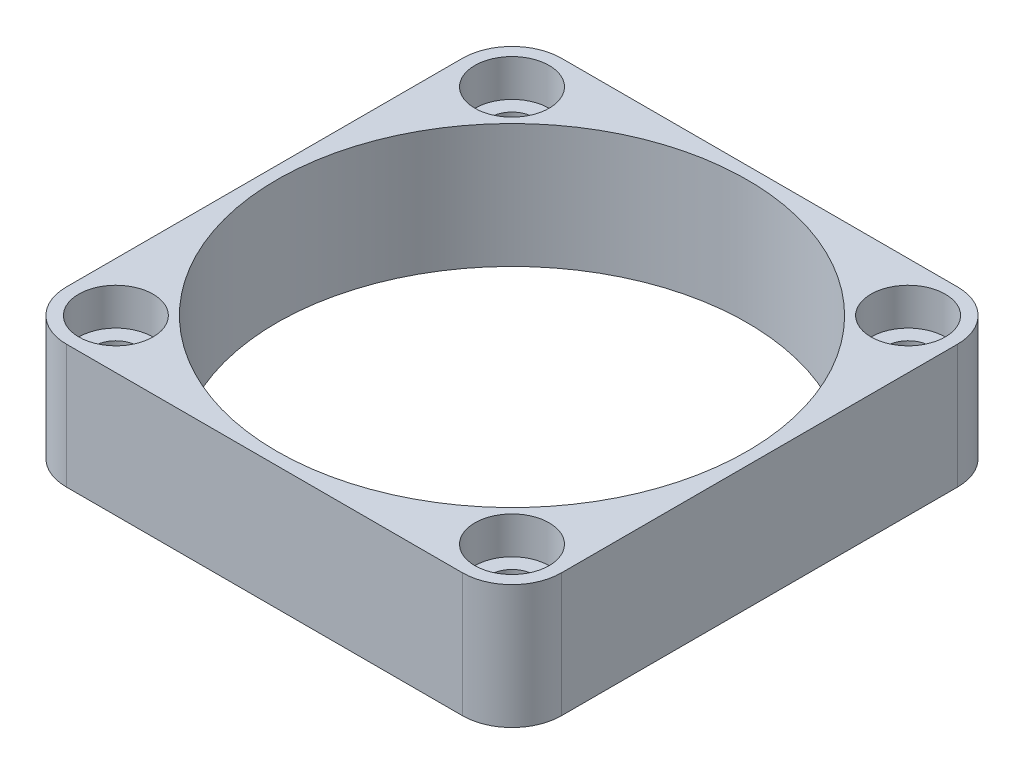
ISO-10303-21;
HEADER;
FILE_DESCRIPTION(('STEP AP214'),'2;1');
FILE_NAME('part.step','',(''),(''),'','','');
FILE_SCHEMA(('AUTOMOTIVE_DESIGN { 1 0 10303 214 1 1 1 1 }'));
ENDSEC;
DATA;
#1=APPLICATION_CONTEXT('core data for automotive mechanical design processes');
#2=APPLICATION_PROTOCOL_DEFINITION('international standard','automotive_design',2000,#1);
#3=PRODUCT_CONTEXT('',#1,'mechanical');
#4=PRODUCT('Part','Part','',(#3));
#5=PRODUCT_RELATED_PRODUCT_CATEGORY('part','',(#4));
#6=PRODUCT_DEFINITION_FORMATION('','',#4);
#7=PRODUCT_DEFINITION_CONTEXT('part definition',#1,'design');
#8=PRODUCT_DEFINITION('design','',#6,#7);
#9=PRODUCT_DEFINITION_SHAPE('','',#8);
#10=(LENGTH_UNIT() NAMED_UNIT(*) SI_UNIT(.MILLI.,.METRE.));
#11=(NAMED_UNIT(*) PLANE_ANGLE_UNIT() SI_UNIT($,.RADIAN.));
#12=(NAMED_UNIT(*) SI_UNIT($,.STERADIAN.) SOLID_ANGLE_UNIT());
#13=UNCERTAINTY_MEASURE_WITH_UNIT(LENGTH_MEASURE(1.E-05),#10,'distance_accuracy_value','');
#14=(GEOMETRIC_REPRESENTATION_CONTEXT(3) GLOBAL_UNCERTAINTY_ASSIGNED_CONTEXT((#13)) GLOBAL_UNIT_ASSIGNED_CONTEXT((#10,
#11,#12)) REPRESENTATION_CONTEXT('',''));
#15=CARTESIAN_POINT('',(0.,0.,0.));
#16=DIRECTION('',(0.,0.,1.));
#17=DIRECTION('',(1.,0.,0.));
#18=AXIS2_PLACEMENT_3D('',#15,#16,#17);
#19=CARTESIAN_POINT('',(4.,0.,-36.));
#20=DIRECTION('',(0.,1.,0.));
#21=DIRECTION('',(0.,0.,1.));
#22=AXIS2_PLACEMENT_3D('',#19,#20,#21);
#23=PLANE('',#22);
#24=CARTESIAN_POINT('',(20.,0.,-20.));
#25=DIRECTION('',(0.,1.,0.));
#26=DIRECTION('',(0.,0.,1.));
#27=AXIS2_PLACEMENT_3D('',#24,#25,#26);
#28=CIRCLE('',#27,19.);
#29=CARTESIAN_POINT('',(20.,0.,-1.));
#30=VERTEX_POINT('',#29);
#31=EDGE_CURVE('E298',#30,#30,#28,.T.);
#32=ORIENTED_EDGE('',*,*,#31,.T.);
#33=EDGE_LOOP('',(#32));
#34=FACE_BOUND('',#33,.T.);
#35=CARTESIAN_POINT('',(4.,0.,-4.));
#36=DIRECTION('',(0.,1.,0.));
#37=DIRECTION('',(0.,0.,1.));
#38=AXIS2_PLACEMENT_3D('',#35,#36,#37);
#39=CIRCLE('',#38,1.75);
#40=CARTESIAN_POINT('',(4.,0.,-2.25));
#41=VERTEX_POINT('',#40);
#42=EDGE_CURVE('E313',#41,#41,#39,.T.);
#43=ORIENTED_EDGE('',*,*,#42,.T.);
#44=EDGE_LOOP('',(#43));
#45=FACE_BOUND('',#44,.T.);
#46=CARTESIAN_POINT('',(36.,0.,-36.));
#47=DIRECTION('',(0.,1.,0.));
#48=DIRECTION('',(0.,0.,1.));
#49=AXIS2_PLACEMENT_3D('',#46,#47,#48);
#50=CIRCLE('',#49,1.75);
#51=CARTESIAN_POINT('',(36.,0.,-34.25));
#52=VERTEX_POINT('',#51);
#53=EDGE_CURVE('E178',#52,#52,#50,.T.);
#54=ORIENTED_EDGE('',*,*,#53,.T.);
#55=EDGE_LOOP('',(#54));
#56=FACE_BOUND('',#55,.T.);
#57=CARTESIAN_POINT('',(4.,0.,-36.));
#58=DIRECTION('',(0.,1.,0.));
#59=DIRECTION('',(0.,0.,1.));
#60=AXIS2_PLACEMENT_3D('',#57,#58,#59);
#61=CIRCLE('',#60,4.);
#62=CARTESIAN_POINT('',(4.00000000000003,0.,-40.));
#63=VERTEX_POINT('',#62);
#64=CARTESIAN_POINT('',(0.,0.,-36.));
#65=VERTEX_POINT('',#64);
#66=EDGE_CURVE('E149',#63,#65,#61,.T.);
#67=ORIENTED_EDGE('',*,*,#66,.F.);
#68=DIRECTION('',(-1.,0.,0.));
#69=VECTOR('',#68,1.);
#70=CARTESIAN_POINT('',(4.00000000000003,0.,-40.));
#71=LINE('',#70,#69);
#72=CARTESIAN_POINT('',(36.,0.,-40.));
#73=VERTEX_POINT('',#72);
#74=EDGE_CURVE('E103',#73,#63,#71,.T.);
#75=ORIENTED_EDGE('',*,*,#74,.F.);
#76=CARTESIAN_POINT('',(36.,0.,-36.));
#77=DIRECTION('',(0.,1.,0.));
#78=DIRECTION('',(0.,0.,1.));
#79=AXIS2_PLACEMENT_3D('',#76,#77,#78);
#80=CIRCLE('',#79,4.);
#81=CARTESIAN_POINT('',(40.,0.,-36.));
#82=VERTEX_POINT('',#81);
#83=EDGE_CURVE('E100',#82,#73,#80,.T.);
#84=ORIENTED_EDGE('',*,*,#83,.F.);
#85=DIRECTION('',(0.,0.,-1.));
#86=VECTOR('',#85,1.);
#87=CARTESIAN_POINT('',(40.,0.,-4.00000000000003));
#88=LINE('',#87,#86);
#89=CARTESIAN_POINT('',(40.,0.,-4.00000000000003));
#90=VERTEX_POINT('',#89);
#91=EDGE_CURVE('E139',#90,#82,#88,.T.);
#92=ORIENTED_EDGE('',*,*,#91,.F.);
#93=CARTESIAN_POINT('',(36.,0.,-4.));
#94=DIRECTION('',(0.,1.,0.));
#95=DIRECTION('',(0.,0.,-1.));
#96=AXIS2_PLACEMENT_3D('',#93,#94,#95);
#97=CIRCLE('',#96,4.);
#98=CARTESIAN_POINT('',(36.,0.,0.));
#99=VERTEX_POINT('',#98);
#100=EDGE_CURVE('E157',#99,#90,#97,.T.);
#101=ORIENTED_EDGE('',*,*,#100,.F.);
#102=DIRECTION('',(1.,0.,0.));
#103=VECTOR('',#102,1.);
#104=CARTESIAN_POINT('',(4.00000000000003,0.,0.));
#105=LINE('',#104,#103);
#106=CARTESIAN_POINT('',(4.00000000000003,0.,0.));
#107=VERTEX_POINT('',#106);
#108=EDGE_CURVE('E160',#107,#99,#105,.T.);
#109=ORIENTED_EDGE('',*,*,#108,.F.);
#110=CARTESIAN_POINT('',(4.,0.,-4.));
#111=DIRECTION('',(0.,1.,0.));
#112=DIRECTION('',(0.,0.,1.));
#113=AXIS2_PLACEMENT_3D('',#110,#111,#112);
#114=CIRCLE('',#113,4.);
#115=CARTESIAN_POINT('',(0.,0.,-4.00000000000003));
#116=VERTEX_POINT('',#115);
#117=EDGE_CURVE('E154',#116,#107,#114,.T.);
#118=ORIENTED_EDGE('',*,*,#117,.F.);
#119=DIRECTION('',(0.,0.,1.));
#120=VECTOR('',#119,1.);
#121=CARTESIAN_POINT('',(0.,0.,-4.00000000000003));
#122=LINE('',#121,#120);
#123=EDGE_CURVE('E155',#65,#116,#122,.T.);
#124=ORIENTED_EDGE('',*,*,#123,.F.);
#125=EDGE_LOOP('',(#67,#75,#84,#92,#101,#109,#118,#124));
#126=FACE_BOUND('',#125,.T.);
#127=CARTESIAN_POINT('',(4.,0.,-36.));
#128=DIRECTION('',(0.,1.,0.));
#129=DIRECTION('',(0.,0.,1.));
#130=AXIS2_PLACEMENT_3D('',#127,#128,#129);
#131=CIRCLE('',#130,1.75);
#132=CARTESIAN_POINT('',(4.,0.,-34.25));
#133=VERTEX_POINT('',#132);
#134=EDGE_CURVE('E306',#133,#133,#131,.F.);
#135=ORIENTED_EDGE('',*,*,#134,.F.);
#136=EDGE_LOOP('',(#135));
#137=FACE_BOUND('',#136,.T.);
#138=CARTESIAN_POINT('',(36.,0.,-4.));
#139=DIRECTION('',(0.,-1.,0.));
#140=DIRECTION('',(0.,0.,-1.));
#141=AXIS2_PLACEMENT_3D('',#138,#139,#140);
#142=CIRCLE('',#141,1.75);
#143=CARTESIAN_POINT('',(36.,0.,-5.75));
#144=VERTEX_POINT('',#143);
#145=EDGE_CURVE('E301',#144,#144,#142,.T.);
#146=ORIENTED_EDGE('',*,*,#145,.F.);
#147=EDGE_LOOP('',(#146));
#148=FACE_BOUND('',#147,.T.);
#149=ADVANCED_FACE('F47',(#34,#45,#56,#126,#137,#148),#23,.F.);
#150=CARTESIAN_POINT('',(4.,10.,-36.));
#151=DIRECTION('',(0.,1.,0.));
#152=DIRECTION('',(0.,0.,1.));
#153=AXIS2_PLACEMENT_3D('',#150,#151,#152);
#154=PLANE('',#153);
#155=CARTESIAN_POINT('',(20.,10.,-20.));
#156=DIRECTION('',(0.,1.,0.));
#157=DIRECTION('',(0.,0.,1.));
#158=AXIS2_PLACEMENT_3D('',#155,#156,#157);
#159=CIRCLE('',#158,19.);
#160=CARTESIAN_POINT('',(20.,10.,-1.));
#161=VERTEX_POINT('',#160);
#162=EDGE_CURVE('E303',#161,#161,#159,.T.);
#163=ORIENTED_EDGE('',*,*,#162,.F.);
#164=EDGE_LOOP('',(#163));
#165=FACE_BOUND('',#164,.T.);
#166=CARTESIAN_POINT('',(4.,10.,-36.));
#167=DIRECTION('',(0.,1.,0.));
#168=DIRECTION('',(0.,0.,1.));
#169=AXIS2_PLACEMENT_3D('',#166,#167,#168);
#170=CIRCLE('',#169,3.);
#171=CARTESIAN_POINT('',(4.,10.,-33.));
#172=VERTEX_POINT('',#171);
#173=EDGE_CURVE('E319',#172,#172,#170,.F.);
#174=ORIENTED_EDGE('',*,*,#173,.T.);
#175=EDGE_LOOP('',(#174));
#176=FACE_BOUND('',#175,.T.);
#177=CARTESIAN_POINT('',(36.,10.,-36.));
#178=DIRECTION('',(0.,1.,0.));
#179=DIRECTION('',(0.,0.,1.));
#180=AXIS2_PLACEMENT_3D('',#177,#178,#179);
#181=CIRCLE('',#180,2.99999999999999);
#182=CARTESIAN_POINT('',(36.,10.,-33.));
#183=VERTEX_POINT('',#182);
#184=EDGE_CURVE('E205',#183,#183,#181,.T.);
#185=ORIENTED_EDGE('',*,*,#184,.F.);
#186=EDGE_LOOP('',(#185));
#187=FACE_BOUND('',#186,.T.);
#188=CARTESIAN_POINT('',(4.,10.,-36.));
#189=DIRECTION('',(0.,1.,0.));
#190=DIRECTION('',(0.,0.,1.));
#191=AXIS2_PLACEMENT_3D('',#188,#189,#190);
#192=CIRCLE('',#191,4.);
#193=CARTESIAN_POINT('',(4.00000000000003,10.,-40.));
#194=VERTEX_POINT('',#193);
#195=CARTESIAN_POINT('',(0.,10.,-36.));
#196=VERTEX_POINT('',#195);
#197=EDGE_CURVE('E163',#194,#196,#192,.T.);
#198=ORIENTED_EDGE('',*,*,#197,.T.);
#199=DIRECTION('',(0.,0.,1.));
#200=VECTOR('',#199,1.);
#201=CARTESIAN_POINT('',(0.,10.,-4.00000000000003));
#202=LINE('',#201,#200);
#203=CARTESIAN_POINT('',(0.,10.,-4.00000000000003));
#204=VERTEX_POINT('',#203);
#205=EDGE_CURVE('E112',#196,#204,#202,.T.);
#206=ORIENTED_EDGE('',*,*,#205,.T.);
#207=CARTESIAN_POINT('',(4.,10.,-4.));
#208=DIRECTION('',(0.,1.,0.));
#209=DIRECTION('',(0.,0.,1.));
#210=AXIS2_PLACEMENT_3D('',#207,#208,#209);
#211=CIRCLE('',#210,4.);
#212=CARTESIAN_POINT('',(4.00000000000003,10.,0.));
#213=VERTEX_POINT('',#212);
#214=EDGE_CURVE('E208',#204,#213,#211,.T.);
#215=ORIENTED_EDGE('',*,*,#214,.T.);
#216=DIRECTION('',(1.,0.,0.));
#217=VECTOR('',#216,1.);
#218=CARTESIAN_POINT('',(4.00000000000003,10.,0.));
#219=LINE('',#218,#217);
#220=CARTESIAN_POINT('',(36.,10.,0.));
#221=VERTEX_POINT('',#220);
#222=EDGE_CURVE('E209',#213,#221,#219,.T.);
#223=ORIENTED_EDGE('',*,*,#222,.T.);
#224=CARTESIAN_POINT('',(36.,10.,-4.));
#225=DIRECTION('',(0.,1.,0.));
#226=DIRECTION('',(0.,0.,-1.));
#227=AXIS2_PLACEMENT_3D('',#224,#225,#226);
#228=CIRCLE('',#227,4.);
#229=CARTESIAN_POINT('',(40.,10.,-4.00000000000003));
#230=VERTEX_POINT('',#229);
#231=EDGE_CURVE('E132',#221,#230,#228,.T.);
#232=ORIENTED_EDGE('',*,*,#231,.T.);
#233=DIRECTION('',(0.,0.,-1.));
#234=VECTOR('',#233,1.);
#235=CARTESIAN_POINT('',(40.,10.,-4.00000000000003));
#236=LINE('',#235,#234);
#237=CARTESIAN_POINT('',(40.,10.,-36.));
#238=VERTEX_POINT('',#237);
#239=EDGE_CURVE('E121',#230,#238,#236,.T.);
#240=ORIENTED_EDGE('',*,*,#239,.T.);
#241=CARTESIAN_POINT('',(36.,10.,-36.));
#242=DIRECTION('',(0.,1.,0.));
#243=DIRECTION('',(0.,0.,1.));
#244=AXIS2_PLACEMENT_3D('',#241,#242,#243);
#245=CIRCLE('',#244,4.);
#246=CARTESIAN_POINT('',(36.,10.,-40.));
#247=VERTEX_POINT('',#246);
#248=EDGE_CURVE('E129',#238,#247,#245,.T.);
#249=ORIENTED_EDGE('',*,*,#248,.T.);
#250=DIRECTION('',(-1.,0.,0.));
#251=VECTOR('',#250,1.);
#252=CARTESIAN_POINT('',(4.00000000000003,10.,-40.));
#253=LINE('',#252,#251);
#254=EDGE_CURVE('E69',#247,#194,#253,.T.);
#255=ORIENTED_EDGE('',*,*,#254,.T.);
#256=EDGE_LOOP('',(#198,#206,#215,#223,#232,#240,#249,#255));
#257=FACE_BOUND('',#256,.T.);
#258=CARTESIAN_POINT('',(4.,10.,-4.));
#259=DIRECTION('',(0.,1.,0.));
#260=DIRECTION('',(0.,0.,1.));
#261=AXIS2_PLACEMENT_3D('',#258,#259,#260);
#262=CIRCLE('',#261,3.);
#263=CARTESIAN_POINT('',(4.,10.,-0.999999999999999));
#264=VERTEX_POINT('',#263);
#265=EDGE_CURVE('E198',#264,#264,#262,.T.);
#266=ORIENTED_EDGE('',*,*,#265,.F.);
#267=EDGE_LOOP('',(#266));
#268=FACE_BOUND('',#267,.T.);
#269=CARTESIAN_POINT('',(36.,10.,-4.));
#270=DIRECTION('',(0.,1.,0.));
#271=DIRECTION('',(0.,0.,1.));
#272=AXIS2_PLACEMENT_3D('',#269,#270,#271);
#273=CIRCLE('',#272,2.99999999999999);
#274=CARTESIAN_POINT('',(36.,10.,-1.00000000000001));
#275=VERTEX_POINT('',#274);
#276=EDGE_CURVE('E190',#275,#275,#273,.F.);
#277=ORIENTED_EDGE('',*,*,#276,.T.);
#278=EDGE_LOOP('',(#277));
#279=FACE_BOUND('',#278,.T.);
#280=ADVANCED_FACE('F127',(#165,#176,#187,#257,#268,#279),#154,.T.);
#281=CARTESIAN_POINT('',(4.,10.,-36.));
#282=DIRECTION('',(0.,-1.,0.));
#283=DIRECTION('',(0.,0.,-1.));
#284=AXIS2_PLACEMENT_3D('',#281,#282,#283);
#285=CYLINDRICAL_SURFACE('',#284,4.);
#286=ORIENTED_EDGE('',*,*,#66,.T.);
#287=DIRECTION('',(0.,-1.,0.));
#288=VECTOR('',#287,1.);
#289=CARTESIAN_POINT('',(0.,10.,-36.));
#290=LINE('',#289,#288);
#291=EDGE_CURVE('E11',#196,#65,#290,.T.);
#292=ORIENTED_EDGE('',*,*,#291,.F.);
#293=ORIENTED_EDGE('',*,*,#197,.F.);
#294=DIRECTION('',(0.,-1.,0.));
#295=VECTOR('',#294,1.);
#296=CARTESIAN_POINT('',(4.00000000000003,10.,-40.));
#297=LINE('',#296,#295);
#298=EDGE_CURVE('E144',#194,#63,#297,.T.);
#299=ORIENTED_EDGE('',*,*,#298,.T.);
#300=EDGE_LOOP('',(#286,#292,#293,#299));
#301=FACE_BOUND('',#300,.T.);
#302=ADVANCED_FACE('F51',(#301),#285,.T.);
#303=CARTESIAN_POINT('',(0.,10.,-4.00000000000003));
#304=DIRECTION('',(1.,0.,0.));
#305=DIRECTION('',(0.,0.,-1.));
#306=AXIS2_PLACEMENT_3D('',#303,#304,#305);
#307=PLANE('',#306);
#308=ORIENTED_EDGE('',*,*,#123,.T.);
#309=DIRECTION('',(0.,-1.,0.));
#310=VECTOR('',#309,1.);
#311=CARTESIAN_POINT('',(0.,10.,-4.00000000000003));
#312=LINE('',#311,#310);
#313=EDGE_CURVE('E56',#204,#116,#312,.T.);
#314=ORIENTED_EDGE('',*,*,#313,.F.);
#315=ORIENTED_EDGE('',*,*,#205,.F.);
#316=ORIENTED_EDGE('',*,*,#291,.T.);
#317=EDGE_LOOP('',(#308,#314,#315,#316));
#318=FACE_BOUND('',#317,.T.);
#319=ADVANCED_FACE('F486',(#318),#307,.F.);
#320=CARTESIAN_POINT('',(4.,10.,-4.));
#321=DIRECTION('',(0.,-1.,0.));
#322=DIRECTION('',(0.,0.,-1.));
#323=AXIS2_PLACEMENT_3D('',#320,#321,#322);
#324=CYLINDRICAL_SURFACE('',#323,4.);
#325=ORIENTED_EDGE('',*,*,#117,.T.);
#326=DIRECTION('',(0.,-1.,0.));
#327=VECTOR('',#326,1.);
#328=CARTESIAN_POINT('',(4.00000000000003,10.,0.));
#329=LINE('',#328,#327);
#330=EDGE_CURVE('E174',#213,#107,#329,.T.);
#331=ORIENTED_EDGE('',*,*,#330,.F.);
#332=ORIENTED_EDGE('',*,*,#214,.F.);
#333=ORIENTED_EDGE('',*,*,#313,.T.);
#334=EDGE_LOOP('',(#325,#331,#332,#333));
#335=FACE_BOUND('',#334,.T.);
#336=ADVANCED_FACE('F480',(#335),#324,.T.);
#337=CARTESIAN_POINT('',(4.00000000000003,10.,0.));
#338=DIRECTION('',(0.,0.,-1.));
#339=DIRECTION('',(-1.,0.,0.));
#340=AXIS2_PLACEMENT_3D('',#337,#338,#339);
#341=PLANE('',#340);
#342=ORIENTED_EDGE('',*,*,#108,.T.);
#343=DIRECTION('',(0.,-1.,0.));
#344=VECTOR('',#343,1.);
#345=CARTESIAN_POINT('',(36.,10.,0.));
#346=LINE('',#345,#344);
#347=EDGE_CURVE('E169',#221,#99,#346,.T.);
#348=ORIENTED_EDGE('',*,*,#347,.F.);
#349=ORIENTED_EDGE('',*,*,#222,.F.);
#350=ORIENTED_EDGE('',*,*,#330,.T.);
#351=EDGE_LOOP('',(#342,#348,#349,#350));
#352=FACE_BOUND('',#351,.T.);
#353=ADVANCED_FACE('F216',(#352),#341,.F.);
#354=CARTESIAN_POINT('',(36.,10.,-4.));
#355=DIRECTION('',(0.,-1.,0.));
#356=DIRECTION('',(0.,0.,-1.));
#357=AXIS2_PLACEMENT_3D('',#354,#355,#356);
#358=CYLINDRICAL_SURFACE('',#357,4.);
#359=ORIENTED_EDGE('',*,*,#100,.T.);
#360=DIRECTION('',(0.,-1.,0.));
#361=VECTOR('',#360,1.);
#362=CARTESIAN_POINT('',(40.,10.,-4.00000000000003));
#363=LINE('',#362,#361);
#364=EDGE_CURVE('E136',#230,#90,#363,.T.);
#365=ORIENTED_EDGE('',*,*,#364,.F.);
#366=ORIENTED_EDGE('',*,*,#231,.F.);
#367=ORIENTED_EDGE('',*,*,#347,.T.);
#368=EDGE_LOOP('',(#359,#365,#366,#367));
#369=FACE_BOUND('',#368,.T.);
#370=ADVANCED_FACE('F219',(#369),#358,.T.);
#371=CARTESIAN_POINT('',(40.,10.,-4.00000000000003));
#372=DIRECTION('',(-1.,0.,0.));
#373=DIRECTION('',(0.,0.,1.));
#374=AXIS2_PLACEMENT_3D('',#371,#372,#373);
#375=PLANE('',#374);
#376=ORIENTED_EDGE('',*,*,#91,.T.);
#377=DIRECTION('',(0.,-1.,0.));
#378=VECTOR('',#377,1.);
#379=CARTESIAN_POINT('',(40.,10.,-36.));
#380=LINE('',#379,#378);
#381=EDGE_CURVE('E137',#238,#82,#380,.T.);
#382=ORIENTED_EDGE('',*,*,#381,.F.);
#383=ORIENTED_EDGE('',*,*,#239,.F.);
#384=ORIENTED_EDGE('',*,*,#364,.T.);
#385=EDGE_LOOP('',(#376,#382,#383,#384));
#386=FACE_BOUND('',#385,.T.);
#387=ADVANCED_FACE('F140',(#386),#375,.F.);
#388=CARTESIAN_POINT('',(36.,10.,-36.));
#389=DIRECTION('',(0.,-1.,0.));
#390=DIRECTION('',(0.,0.,-1.));
#391=AXIS2_PLACEMENT_3D('',#388,#389,#390);
#392=CYLINDRICAL_SURFACE('',#391,4.);
#393=ORIENTED_EDGE('',*,*,#83,.T.);
#394=DIRECTION('',(0.,-1.,0.));
#395=VECTOR('',#394,1.);
#396=CARTESIAN_POINT('',(36.,10.,-40.));
#397=LINE('',#396,#395);
#398=EDGE_CURVE('E143',#247,#73,#397,.T.);
#399=ORIENTED_EDGE('',*,*,#398,.F.);
#400=ORIENTED_EDGE('',*,*,#248,.F.);
#401=ORIENTED_EDGE('',*,*,#381,.T.);
#402=EDGE_LOOP('',(#393,#399,#400,#401));
#403=FACE_BOUND('',#402,.T.);
#404=ADVANCED_FACE('F141',(#403),#392,.T.);
#405=CARTESIAN_POINT('',(4.00000000000003,10.,-40.));
#406=DIRECTION('',(0.,0.,1.));
#407=DIRECTION('',(1.,0.,0.));
#408=AXIS2_PLACEMENT_3D('',#405,#406,#407);
#409=PLANE('',#408);
#410=ORIENTED_EDGE('',*,*,#74,.T.);
#411=ORIENTED_EDGE('',*,*,#298,.F.);
#412=ORIENTED_EDGE('',*,*,#254,.F.);
#413=ORIENTED_EDGE('',*,*,#398,.T.);
#414=EDGE_LOOP('',(#410,#411,#412,#413));
#415=FACE_BOUND('',#414,.T.);
#416=ADVANCED_FACE('F230',(#415),#409,.F.);
#417=CARTESIAN_POINT('',(36.,7.,-36.));
#418=DIRECTION('',(0.,1.,0.));
#419=DIRECTION('',(0.,0.,1.));
#420=AXIS2_PLACEMENT_3D('',#417,#418,#419);
#421=CYLINDRICAL_SURFACE('',#420,2.99999999999999);
#422=CARTESIAN_POINT('',(36.,7.,-36.));
#423=DIRECTION('',(0.,1.,0.));
#424=DIRECTION('',(0.,0.,1.));
#425=AXIS2_PLACEMENT_3D('',#422,#423,#424);
#426=CIRCLE('',#425,2.99999999999999);
#427=CARTESIAN_POINT('',(36.,7.,-33.));
#428=VERTEX_POINT('',#427);
#429=EDGE_CURVE('E153',#428,#428,#426,.T.);
#430=ORIENTED_EDGE('',*,*,#429,.F.);
#431=EDGE_LOOP('',(#430));
#432=FACE_BOUND('',#431,.T.);
#433=ORIENTED_EDGE('',*,*,#184,.T.);
#434=EDGE_LOOP('',(#433));
#435=FACE_BOUND('',#434,.T.);
#436=ADVANCED_FACE('F227',(#432,#435),#421,.F.);
#437=CARTESIAN_POINT('',(0.,7.,0.));
#438=DIRECTION('',(0.,1.,0.));
#439=DIRECTION('',(0.,0.,1.));
#440=AXIS2_PLACEMENT_3D('',#437,#438,#439);
#441=PLANE('',#440);
#442=CARTESIAN_POINT('',(36.,7.,-36.));
#443=DIRECTION('',(0.,1.,0.));
#444=DIRECTION('',(0.,0.,1.));
#445=AXIS2_PLACEMENT_3D('',#442,#443,#444);
#446=CIRCLE('',#445,1.75);
#447=CARTESIAN_POINT('',(36.,7.,-34.25));
#448=VERTEX_POINT('',#447);
#449=EDGE_CURVE('E52',#448,#448,#446,.T.);
#450=ORIENTED_EDGE('',*,*,#449,.F.);
#451=EDGE_LOOP('',(#450));
#452=FACE_BOUND('',#451,.T.);
#453=ORIENTED_EDGE('',*,*,#429,.T.);
#454=EDGE_LOOP('',(#453));
#455=FACE_BOUND('',#454,.T.);
#456=ADVANCED_FACE('F237',(#452,#455),#441,.T.);
#457=CARTESIAN_POINT('',(4.,7.,-36.));
#458=DIRECTION('',(0.,1.,0.));
#459=DIRECTION('',(0.,0.,1.));
#460=AXIS2_PLACEMENT_3D('',#457,#458,#459);
#461=CYLINDRICAL_SURFACE('',#460,3.);
#462=CARTESIAN_POINT('',(4.,7.,-36.));
#463=DIRECTION('',(0.,1.,0.));
#464=DIRECTION('',(0.,0.,1.));
#465=AXIS2_PLACEMENT_3D('',#462,#463,#464);
#466=CIRCLE('',#465,3.);
#467=CARTESIAN_POINT('',(4.,7.,-33.));
#468=VERTEX_POINT('',#467);
#469=EDGE_CURVE('E202',#468,#468,#466,.F.);
#470=ORIENTED_EDGE('',*,*,#469,.T.);
#471=EDGE_LOOP('',(#470));
#472=FACE_BOUND('',#471,.T.);
#473=ORIENTED_EDGE('',*,*,#173,.F.);
#474=EDGE_LOOP('',(#473));
#475=FACE_BOUND('',#474,.T.);
#476=ADVANCED_FACE('F251',(#472,#475),#461,.F.);
#477=CARTESIAN_POINT('',(0.,7.,0.));
#478=DIRECTION('',(0.,1.,0.));
#479=DIRECTION('',(0.,0.,1.));
#480=AXIS2_PLACEMENT_3D('',#477,#478,#479);
#481=PLANE('',#480);
#482=CARTESIAN_POINT('',(4.,7.,-36.));
#483=DIRECTION('',(0.,1.,0.));
#484=DIRECTION('',(0.,0.,1.));
#485=AXIS2_PLACEMENT_3D('',#482,#483,#484);
#486=CIRCLE('',#485,1.75);
#487=CARTESIAN_POINT('',(4.,7.,-34.25));
#488=VERTEX_POINT('',#487);
#489=EDGE_CURVE('E185',#488,#488,#486,.F.);
#490=ORIENTED_EDGE('',*,*,#489,.T.);
#491=EDGE_LOOP('',(#490));
#492=FACE_BOUND('',#491,.T.);
#493=ORIENTED_EDGE('',*,*,#469,.F.);
#494=EDGE_LOOP('',(#493));
#495=FACE_BOUND('',#494,.T.);
#496=ADVANCED_FACE('F268',(#492,#495),#481,.T.);
#497=CARTESIAN_POINT('',(4.,7.,-4.));
#498=DIRECTION('',(0.,1.,0.));
#499=DIRECTION('',(0.,0.,1.));
#500=AXIS2_PLACEMENT_3D('',#497,#498,#499);
#501=CYLINDRICAL_SURFACE('',#500,3.);
#502=CARTESIAN_POINT('',(4.,7.,-4.));
#503=DIRECTION('',(0.,1.,0.));
#504=DIRECTION('',(0.,0.,1.));
#505=AXIS2_PLACEMENT_3D('',#502,#503,#504);
#506=CIRCLE('',#505,3.);
#507=CARTESIAN_POINT('',(4.,7.,-0.999999999999999));
#508=VERTEX_POINT('',#507);
#509=EDGE_CURVE('E323',#508,#508,#506,.T.);
#510=ORIENTED_EDGE('',*,*,#509,.F.);
#511=EDGE_LOOP('',(#510));
#512=FACE_BOUND('',#511,.T.);
#513=ORIENTED_EDGE('',*,*,#265,.T.);
#514=EDGE_LOOP('',(#513));
#515=FACE_BOUND('',#514,.T.);
#516=ADVANCED_FACE('F264',(#512,#515),#501,.F.);
#517=CARTESIAN_POINT('',(0.,7.,0.));
#518=DIRECTION('',(0.,1.,0.));
#519=DIRECTION('',(0.,0.,1.));
#520=AXIS2_PLACEMENT_3D('',#517,#518,#519);
#521=PLANE('',#520);
#522=CARTESIAN_POINT('',(4.,7.,-4.));
#523=DIRECTION('',(0.,1.,0.));
#524=DIRECTION('',(0.,0.,1.));
#525=AXIS2_PLACEMENT_3D('',#522,#523,#524);
#526=CIRCLE('',#525,1.75);
#527=CARTESIAN_POINT('',(4.,7.,-2.25));
#528=VERTEX_POINT('',#527);
#529=EDGE_CURVE('E176',#528,#528,#526,.T.);
#530=ORIENTED_EDGE('',*,*,#529,.F.);
#531=EDGE_LOOP('',(#530));
#532=FACE_BOUND('',#531,.T.);
#533=ORIENTED_EDGE('',*,*,#509,.T.);
#534=EDGE_LOOP('',(#533));
#535=FACE_BOUND('',#534,.T.);
#536=ADVANCED_FACE('F259',(#532,#535),#521,.T.);
#537=CARTESIAN_POINT('',(36.,7.,-4.));
#538=DIRECTION('',(0.,1.,0.));
#539=DIRECTION('',(0.,0.,1.));
#540=AXIS2_PLACEMENT_3D('',#537,#538,#539);
#541=CYLINDRICAL_SURFACE('',#540,2.99999999999999);
#542=CARTESIAN_POINT('',(36.,7.,-4.));
#543=DIRECTION('',(0.,1.,0.));
#544=DIRECTION('',(0.,0.,1.));
#545=AXIS2_PLACEMENT_3D('',#542,#543,#544);
#546=CIRCLE('',#545,2.99999999999999);
#547=CARTESIAN_POINT('',(36.,7.,-1.00000000000001));
#548=VERTEX_POINT('',#547);
#549=EDGE_CURVE('E192',#548,#548,#546,.F.);
#550=ORIENTED_EDGE('',*,*,#549,.T.);
#551=EDGE_LOOP('',(#550));
#552=FACE_BOUND('',#551,.T.);
#553=ORIENTED_EDGE('',*,*,#276,.F.);
#554=EDGE_LOOP('',(#553));
#555=FACE_BOUND('',#554,.T.);
#556=ADVANCED_FACE('F254',(#552,#555),#541,.F.);
#557=CARTESIAN_POINT('',(0.,7.,0.));
#558=DIRECTION('',(0.,1.,0.));
#559=DIRECTION('',(0.,0.,1.));
#560=AXIS2_PLACEMENT_3D('',#557,#558,#559);
#561=PLANE('',#560);
#562=CARTESIAN_POINT('',(36.,7.,-4.));
#563=DIRECTION('',(0.,1.,0.));
#564=DIRECTION('',(0.,0.,1.));
#565=AXIS2_PLACEMENT_3D('',#562,#563,#564);
#566=CIRCLE('',#565,1.75);
#567=CARTESIAN_POINT('',(36.,7.,-2.25));
#568=VERTEX_POINT('',#567);
#569=EDGE_CURVE('E177',#568,#568,#566,.F.);
#570=ORIENTED_EDGE('',*,*,#569,.T.);
#571=EDGE_LOOP('',(#570));
#572=FACE_BOUND('',#571,.T.);
#573=ORIENTED_EDGE('',*,*,#549,.F.);
#574=EDGE_LOOP('',(#573));
#575=FACE_BOUND('',#574,.T.);
#576=ADVANCED_FACE('F256',(#572,#575),#561,.T.);
#577=CARTESIAN_POINT('',(36.,0.,-4.));
#578=DIRECTION('',(0.,1.,0.));
#579=DIRECTION('',(0.,0.,1.));
#580=AXIS2_PLACEMENT_3D('',#577,#578,#579);
#581=CYLINDRICAL_SURFACE('',#580,1.75);
#582=ORIENTED_EDGE('',*,*,#569,.F.);
#583=EDGE_LOOP('',(#582));
#584=FACE_BOUND('',#583,.T.);
#585=ORIENTED_EDGE('',*,*,#145,.T.);
#586=EDGE_LOOP('',(#585));
#587=FACE_BOUND('',#586,.T.);
#588=ADVANCED_FACE('F263',(#584,#587),#581,.F.);
#589=CARTESIAN_POINT('',(4.,0.,-4.));
#590=DIRECTION('',(0.,1.,0.));
#591=DIRECTION('',(0.,0.,1.));
#592=AXIS2_PLACEMENT_3D('',#589,#590,#591);
#593=CYLINDRICAL_SURFACE('',#592,1.75);
#594=ORIENTED_EDGE('',*,*,#529,.T.);
#595=EDGE_LOOP('',(#594));
#596=FACE_BOUND('',#595,.T.);
#597=ORIENTED_EDGE('',*,*,#42,.F.);
#598=EDGE_LOOP('',(#597));
#599=FACE_BOUND('',#598,.T.);
#600=ADVANCED_FACE('F282',(#596,#599),#593,.F.);
#601=CARTESIAN_POINT('',(4.,0.,-36.));
#602=DIRECTION('',(0.,1.,0.));
#603=DIRECTION('',(0.,0.,1.));
#604=AXIS2_PLACEMENT_3D('',#601,#602,#603);
#605=CYLINDRICAL_SURFACE('',#604,1.75);
#606=ORIENTED_EDGE('',*,*,#489,.F.);
#607=EDGE_LOOP('',(#606));
#608=FACE_BOUND('',#607,.T.);
#609=ORIENTED_EDGE('',*,*,#134,.T.);
#610=EDGE_LOOP('',(#609));
#611=FACE_BOUND('',#610,.T.);
#612=ADVANCED_FACE('F281',(#608,#611),#605,.F.);
#613=CARTESIAN_POINT('',(36.,0.,-36.));
#614=DIRECTION('',(0.,1.,0.));
#615=DIRECTION('',(0.,0.,1.));
#616=AXIS2_PLACEMENT_3D('',#613,#614,#615);
#617=CYLINDRICAL_SURFACE('',#616,1.75);
#618=ORIENTED_EDGE('',*,*,#449,.T.);
#619=EDGE_LOOP('',(#618));
#620=FACE_BOUND('',#619,.T.);
#621=ORIENTED_EDGE('',*,*,#53,.F.);
#622=EDGE_LOOP('',(#621));
#623=FACE_BOUND('',#622,.T.);
#624=ADVANCED_FACE('F279',(#620,#623),#617,.F.);
#625=CARTESIAN_POINT('',(20.,0.,-20.));
#626=DIRECTION('',(0.,1.,0.));
#627=DIRECTION('',(0.,0.,1.));
#628=AXIS2_PLACEMENT_3D('',#625,#626,#627);
#629=CYLINDRICAL_SURFACE('',#628,19.);
#630=ORIENTED_EDGE('',*,*,#31,.F.);
#631=EDGE_LOOP('',(#630));
#632=FACE_BOUND('',#631,.T.);
#633=ORIENTED_EDGE('',*,*,#162,.T.);
#634=EDGE_LOOP('',(#633));
#635=FACE_BOUND('',#634,.T.);
#636=ADVANCED_FACE('F284',(#632,#635),#629,.F.);
#637=CLOSED_SHELL('',(#149,#280,#302,#319,#336,#353,#370,#387,#404,#416,#436,#456,#476,#496,
#516,#536,#556,#576,#588,#600,#612,#624,#636));
#638=MANIFOLD_SOLID_BREP('B2',#637);
#639=ADVANCED_BREP_SHAPE_REPRESENTATION('',(#18,#638),#14);
#640=SHAPE_DEFINITION_REPRESENTATION(#9,#639);
ENDSEC;
END-ISO-10303-21;
